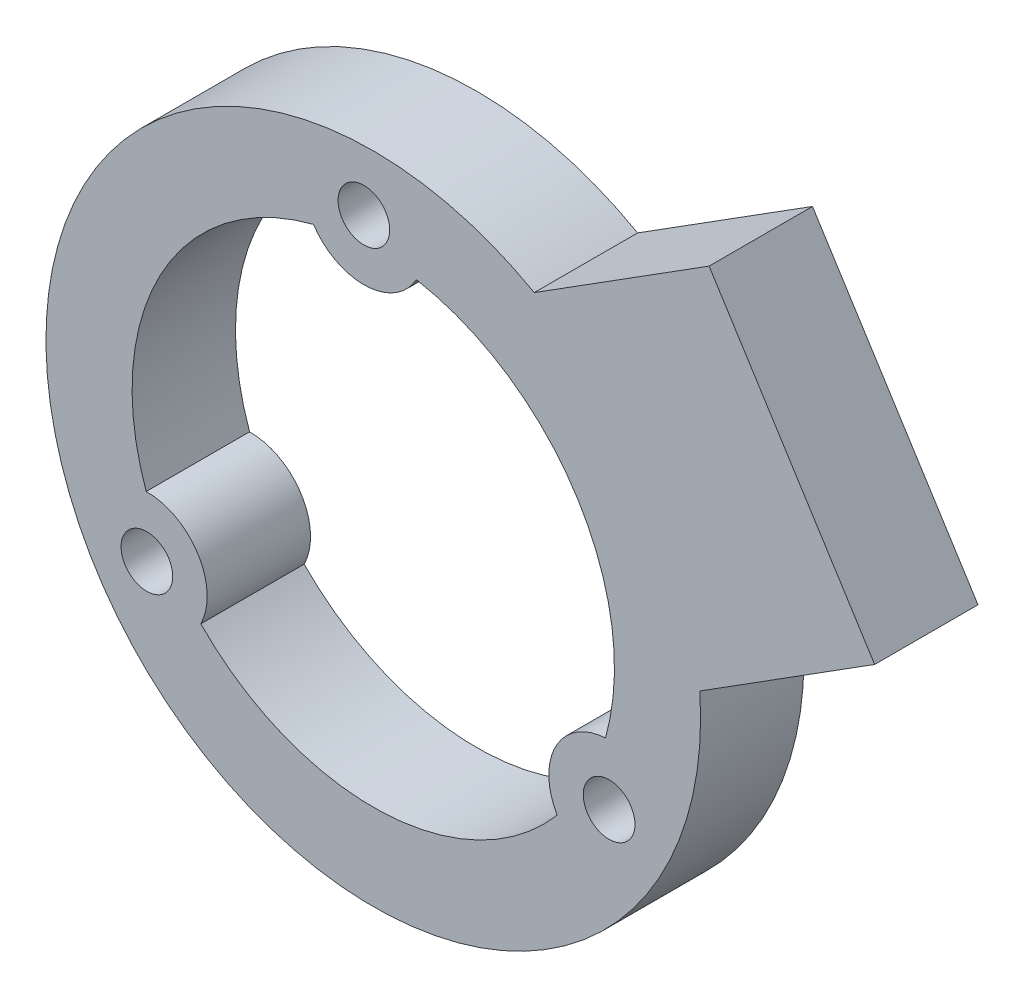
ISO-10303-21;
HEADER;
FILE_DESCRIPTION(('STEP AP214'),'2;1');
FILE_NAME('part.step','',(''),(''),'','','');
FILE_SCHEMA(('AUTOMOTIVE_DESIGN { 1 0 10303 214 1 1 1 1 }'));
ENDSEC;
DATA;
#1=APPLICATION_CONTEXT('core data for automotive mechanical design processes');
#2=APPLICATION_PROTOCOL_DEFINITION('international standard','automotive_design',2000,#1);
#3=PRODUCT_CONTEXT('',#1,'mechanical');
#4=PRODUCT('Part','Part','',(#3));
#5=PRODUCT_RELATED_PRODUCT_CATEGORY('part','',(#4));
#6=PRODUCT_DEFINITION_FORMATION('','',#4);
#7=PRODUCT_DEFINITION_CONTEXT('part definition',#1,'design');
#8=PRODUCT_DEFINITION('design','',#6,#7);
#9=PRODUCT_DEFINITION_SHAPE('','',#8);
#10=(LENGTH_UNIT() NAMED_UNIT(*) SI_UNIT(.MILLI.,.METRE.));
#11=(NAMED_UNIT(*) PLANE_ANGLE_UNIT() SI_UNIT($,.RADIAN.));
#12=(NAMED_UNIT(*) SI_UNIT($,.STERADIAN.) SOLID_ANGLE_UNIT());
#13=UNCERTAINTY_MEASURE_WITH_UNIT(LENGTH_MEASURE(1.E-05),#10,'distance_accuracy_value','');
#14=(GEOMETRIC_REPRESENTATION_CONTEXT(3) GLOBAL_UNCERTAINTY_ASSIGNED_CONTEXT((#13)) GLOBAL_UNIT_ASSIGNED_CONTEXT((#10,
#11,#12)) REPRESENTATION_CONTEXT('',''));
#15=CARTESIAN_POINT('',(0.,0.,0.));
#16=DIRECTION('',(0.,0.,1.));
#17=DIRECTION('',(1.,0.,0.));
#18=AXIS2_PLACEMENT_3D('',#15,#16,#17);
#19=CARTESIAN_POINT('',(0.,0.,6.));
#20=DIRECTION('',(0.,0.,1.));
#21=DIRECTION('',(1.,0.,0.));
#22=AXIS2_PLACEMENT_3D('',#19,#20,#21);
#23=PLANE('',#22);
#24=CARTESIAN_POINT('',(-13.1416847795504,-8.21864472738256,6.));
#25=DIRECTION('',(0.,0.,1.));
#26=DIRECTION('',(1.,0.,0.));
#27=AXIS2_PLACEMENT_3D('',#24,#25,#26);
#28=CIRCLE('',#27,1.5);
#29=CARTESIAN_POINT('',(-11.6416847795504,-8.21864472738256,6.));
#30=VERTEX_POINT('',#29);
#31=EDGE_CURVE('E274',#30,#30,#28,.T.);
#32=ORIENTED_EDGE('',*,*,#31,.F.);
#33=EDGE_LOOP('',(#32));
#34=FACE_BOUND('',#33,.T.);
#35=CARTESIAN_POINT('',(13.6883975083675,-7.2717105039268,6.));
#36=DIRECTION('',(0.,0.,-1.));
#37=DIRECTION('',(1.,0.,0.));
#38=AXIS2_PLACEMENT_3D('',#35,#36,#37);
#39=CIRCLE('',#38,3.5);
#40=CARTESIAN_POINT('',(10.6770331705431,-9.0554382928228,6.));
#41=VERTEX_POINT('',#40);
#42=CARTESIAN_POINT('',(13.4806381865757,-3.77788222191169,6.));
#43=VERTEX_POINT('',#42);
#44=EDGE_CURVE('E117',#41,#43,#39,.T.);
#45=ORIENTED_EDGE('',*,*,#44,.F.);
#46=CARTESIAN_POINT('',(0.,0.,6.));
#47=DIRECTION('',(0.,0.,1.));
#48=DIRECTION('',(1.,0.,0.));
#49=AXIS2_PLACEMENT_3D('',#46,#47,#48);
#50=CIRCLE('',#49,14.);
#51=CARTESIAN_POINT('',(-10.0120610699689,-9.78563401784541,6.));
#52=VERTEX_POINT('',#51);
#53=EDGE_CURVE('E109',#52,#41,#50,.T.);
#54=ORIENTED_EDGE('',*,*,#53,.F.);
#55=CARTESIAN_POINT('',(-13.1416847795504,-8.21864472738256,6.));
#56=DIRECTION('',(0.,0.,-1.));
#57=DIRECTION('',(1.,0.,0.));
#58=AXIS2_PLACEMENT_3D('',#55,#56,#57);
#59=CIRCLE('',#58,3.5);
#60=CARTESIAN_POINT('',(-13.1807561892585,-4.71886281632819,6.));
#61=VERTEX_POINT('',#60);
#62=EDGE_CURVE('E140',#61,#52,#59,.T.);
#63=ORIENTED_EDGE('',*,*,#62,.F.);
#64=CARTESIAN_POINT('',(0.,0.,6.));
#65=DIRECTION('',(0.,0.,1.));
#66=DIRECTION('',(1.,0.,0.));
#67=AXIS2_PLACEMENT_3D('',#64,#65,#66);
#68=CIRCLE('',#67,14.);
#69=CARTESIAN_POINT('',(-3.46857711660661,13.563516239757,6.));
#70=VERTEX_POINT('',#69);
#71=EDGE_CURVE('E138',#70,#61,#68,.T.);
#72=ORIENTED_EDGE('',*,*,#71,.F.);
#73=CARTESIAN_POINT('',(-0.546712728816841,15.4903552313092,6.));
#74=DIRECTION('',(0.,0.,-1.));
#75=DIRECTION('',(1.,0.,0.));
#76=AXIS2_PLACEMENT_3D('',#73,#74,#75);
#77=CIRCLE('',#76,3.5);
#78=CARTESIAN_POINT('',(2.5037230187155,13.7743011091508,6.));
#79=VERTEX_POINT('',#78);
#80=EDGE_CURVE('E133',#79,#70,#77,.T.);
#81=ORIENTED_EDGE('',*,*,#80,.F.);
#82=CARTESIAN_POINT('',(0.,0.,6.));
#83=DIRECTION('',(0.,0.,1.));
#84=DIRECTION('',(1.,0.,0.));
#85=AXIS2_PLACEMENT_3D('',#82,#83,#84);
#86=CIRCLE('',#85,14.);
#87=EDGE_CURVE('E131',#43,#79,#86,.T.);
#88=ORIENTED_EDGE('',*,*,#87,.F.);
#89=EDGE_LOOP('',(#45,#54,#63,#72,#81,#88));
#90=FACE_BOUND('',#89,.T.);
#91=DIRECTION('',(0.845574343467549,0.533857686719432,0.));
#92=VECTOR('',#91,1.);
#93=CARTESIAN_POINT('',(29.1009265892722,7.72711675535672,6.));
#94=LINE('',#93,#92);
#95=CARTESIAN_POINT('',(18.9540344676616,1.32082451472354,6.));
#96=VERTEX_POINT('',#95);
#97=CARTESIAN_POINT('',(29.1009265892722,7.72711675535672,6.));
#98=VERTEX_POINT('',#97);
#99=EDGE_CURVE('E163',#96,#98,#94,.T.);
#100=ORIENTED_EDGE('',*,*,#99,.T.);
#101=DIRECTION('',(-0.533801721376277,0.845609674882994,0.));
#102=VECTOR('',#101,1.);
#103=CARTESIAN_POINT('',(29.1009265892722,7.72711675535672,6.));
#104=LINE('',#103,#102);
#105=CARTESIAN_POINT('',(19.4924956044992,22.9480909032506,6.));
#106=VERTEX_POINT('',#105);
#107=EDGE_CURVE('E166',#98,#106,#104,.T.);
#108=ORIENTED_EDGE('',*,*,#107,.T.);
#109=DIRECTION('',(-0.845645004348162,-0.533745750916105,0.));
#110=VECTOR('',#109,1.);
#111=CARTESIAN_POINT('',(19.4924956044992,22.9480909032506,6.));
#112=LINE('',#111,#110);
#113=CARTESIAN_POINT('',(9.34475555232128,16.5431418922574,6.));
#114=VERTEX_POINT('',#113);
#115=EDGE_CURVE('E169',#106,#114,#112,.T.);
#116=ORIENTED_EDGE('',*,*,#115,.T.);
#117=CARTESIAN_POINT('',(0.,0.,6.));
#118=DIRECTION('',(0.,0.,1.));
#119=DIRECTION('',(1.,0.,0.));
#120=AXIS2_PLACEMENT_3D('',#117,#118,#119);
#121=CIRCLE('',#120,19.);
#122=EDGE_CURVE('E171',#114,#96,#121,.T.);
#123=ORIENTED_EDGE('',*,*,#122,.T.);
#124=EDGE_LOOP('',(#100,#108,#116,#123));
#125=FACE_BOUND('',#124,.T.);
#126=CARTESIAN_POINT('',(-0.546712728816841,15.4903552313092,6.));
#127=DIRECTION('',(0.,0.,1.));
#128=DIRECTION('',(1.,0.,0.));
#129=AXIS2_PLACEMENT_3D('',#126,#127,#128);
#130=CIRCLE('',#129,1.5);
#131=CARTESIAN_POINT('',(0.953287271183161,15.4903552313092,6.));
#132=VERTEX_POINT('',#131);
#133=EDGE_CURVE('E143',#132,#132,#130,.T.);
#134=ORIENTED_EDGE('',*,*,#133,.F.);
#135=EDGE_LOOP('',(#134));
#136=FACE_BOUND('',#135,.T.);
#137=CARTESIAN_POINT('',(13.6883975083675,-7.2717105039268,6.));
#138=DIRECTION('',(0.,0.,1.));
#139=DIRECTION('',(1.,0.,0.));
#140=AXIS2_PLACEMENT_3D('',#137,#138,#139);
#141=CIRCLE('',#140,1.5);
#142=CARTESIAN_POINT('',(15.1883975083675,-7.2717105039268,6.));
#143=VERTEX_POINT('',#142);
#144=EDGE_CURVE('E265',#143,#143,#141,.T.);
#145=ORIENTED_EDGE('',*,*,#144,.F.);
#146=EDGE_LOOP('',(#145));
#147=FACE_BOUND('',#146,.T.);
#148=ADVANCED_FACE('F32',(#34,#90,#125,#136,#147),#23,.T.);
#149=CARTESIAN_POINT('',(0.,0.,0.));
#150=DIRECTION('',(0.,0.,1.));
#151=DIRECTION('',(1.,0.,0.));
#152=AXIS2_PLACEMENT_3D('',#149,#150,#151);
#153=PLANE('',#152);
#154=DIRECTION('',(0.845574343467549,0.533857686719432,0.));
#155=VECTOR('',#154,1.);
#156=CARTESIAN_POINT('',(29.1009265892722,7.72711675535672,0.));
#157=LINE('',#156,#155);
#158=CARTESIAN_POINT('',(18.9540344676616,1.32082451472354,0.));
#159=VERTEX_POINT('',#158);
#160=CARTESIAN_POINT('',(29.1009265892722,7.72711675535672,0.));
#161=VERTEX_POINT('',#160);
#162=EDGE_CURVE('E125',#159,#161,#157,.T.);
#163=ORIENTED_EDGE('',*,*,#162,.F.);
#164=CARTESIAN_POINT('',(0.,0.,0.));
#165=DIRECTION('',(0.,0.,1.));
#166=DIRECTION('',(1.,0.,0.));
#167=AXIS2_PLACEMENT_3D('',#164,#165,#166);
#168=CIRCLE('',#167,19.);
#169=CARTESIAN_POINT('',(9.34475555232128,16.5431418922574,0.));
#170=VERTEX_POINT('',#169);
#171=EDGE_CURVE('E167',#170,#159,#168,.T.);
#172=ORIENTED_EDGE('',*,*,#171,.F.);
#173=DIRECTION('',(-0.845645004348162,-0.533745750916105,0.));
#174=VECTOR('',#173,1.);
#175=CARTESIAN_POINT('',(19.4924956044992,22.9480909032506,0.));
#176=LINE('',#175,#174);
#177=CARTESIAN_POINT('',(19.4924956044992,22.9480909032506,0.));
#178=VERTEX_POINT('',#177);
#179=EDGE_CURVE('E178',#178,#170,#176,.T.);
#180=ORIENTED_EDGE('',*,*,#179,.F.);
#181=DIRECTION('',(-0.533801721376277,0.845609674882994,0.));
#182=VECTOR('',#181,1.);
#183=CARTESIAN_POINT('',(29.1009265892722,7.72711675535672,0.));
#184=LINE('',#183,#182);
#185=EDGE_CURVE('E176',#161,#178,#184,.T.);
#186=ORIENTED_EDGE('',*,*,#185,.F.);
#187=EDGE_LOOP('',(#163,#172,#180,#186));
#188=FACE_BOUND('',#187,.T.);
#189=CARTESIAN_POINT('',(0.,0.,0.));
#190=DIRECTION('',(0.,0.,1.));
#191=DIRECTION('',(1.,0.,0.));
#192=AXIS2_PLACEMENT_3D('',#189,#190,#191);
#193=CIRCLE('',#192,14.);
#194=CARTESIAN_POINT('',(-10.0120610699689,-9.78563401784541,0.));
#195=VERTEX_POINT('',#194);
#196=CARTESIAN_POINT('',(10.6770331705431,-9.0554382928228,0.));
#197=VERTEX_POINT('',#196);
#198=EDGE_CURVE('E55',#195,#197,#193,.T.);
#199=ORIENTED_EDGE('',*,*,#198,.T.);
#200=CARTESIAN_POINT('',(13.6883975083675,-7.2717105039268,0.));
#201=DIRECTION('',(0.,0.,-1.));
#202=DIRECTION('',(1.,0.,0.));
#203=AXIS2_PLACEMENT_3D('',#200,#201,#202);
#204=CIRCLE('',#203,3.5);
#205=CARTESIAN_POINT('',(13.4806381865757,-3.77788222191169,0.));
#206=VERTEX_POINT('',#205);
#207=EDGE_CURVE('E124',#197,#206,#204,.T.);
#208=ORIENTED_EDGE('',*,*,#207,.T.);
#209=CARTESIAN_POINT('',(0.,0.,0.));
#210=DIRECTION('',(0.,0.,1.));
#211=DIRECTION('',(1.,0.,0.));
#212=AXIS2_PLACEMENT_3D('',#209,#210,#211);
#213=CIRCLE('',#212,14.);
#214=CARTESIAN_POINT('',(2.5037230187155,13.7743011091508,0.));
#215=VERTEX_POINT('',#214);
#216=EDGE_CURVE('E145',#206,#215,#213,.T.);
#217=ORIENTED_EDGE('',*,*,#216,.T.);
#218=CARTESIAN_POINT('',(-0.546712728816841,15.4903552313092,0.));
#219=DIRECTION('',(0.,0.,-1.));
#220=DIRECTION('',(1.,0.,0.));
#221=AXIS2_PLACEMENT_3D('',#218,#219,#220);
#222=CIRCLE('',#221,3.5);
#223=CARTESIAN_POINT('',(-3.46857711660661,13.563516239757,0.));
#224=VERTEX_POINT('',#223);
#225=EDGE_CURVE('E148',#215,#224,#222,.T.);
#226=ORIENTED_EDGE('',*,*,#225,.T.);
#227=CARTESIAN_POINT('',(0.,0.,0.));
#228=DIRECTION('',(0.,0.,1.));
#229=DIRECTION('',(1.,0.,0.));
#230=AXIS2_PLACEMENT_3D('',#227,#228,#229);
#231=CIRCLE('',#230,14.);
#232=CARTESIAN_POINT('',(-13.1807561892585,-4.71886281632818,0.));
#233=VERTEX_POINT('',#232);
#234=EDGE_CURVE('E151',#224,#233,#231,.T.);
#235=ORIENTED_EDGE('',*,*,#234,.T.);
#236=CARTESIAN_POINT('',(-13.1416847795504,-8.21864472738256,0.));
#237=DIRECTION('',(0.,0.,-1.));
#238=DIRECTION('',(1.,0.,0.));
#239=AXIS2_PLACEMENT_3D('',#236,#237,#238);
#240=CIRCLE('',#239,3.5);
#241=EDGE_CURVE('E118',#233,#195,#240,.T.);
#242=ORIENTED_EDGE('',*,*,#241,.T.);
#243=EDGE_LOOP('',(#199,#208,#217,#226,#235,#242));
#244=FACE_BOUND('',#243,.T.);
#245=CARTESIAN_POINT('',(-0.546712728816841,15.4903552313092,0.));
#246=DIRECTION('',(0.,0.,1.));
#247=DIRECTION('',(1.,0.,0.));
#248=AXIS2_PLACEMENT_3D('',#245,#246,#247);
#249=CIRCLE('',#248,1.5);
#250=CARTESIAN_POINT('',(0.953287271183161,15.4903552313092,0.));
#251=VERTEX_POINT('',#250);
#252=EDGE_CURVE('E277',#251,#251,#249,.T.);
#253=ORIENTED_EDGE('',*,*,#252,.T.);
#254=EDGE_LOOP('',(#253));
#255=FACE_BOUND('',#254,.T.);
#256=CARTESIAN_POINT('',(-13.1416847795504,-8.21864472738256,0.));
#257=DIRECTION('',(0.,0.,1.));
#258=DIRECTION('',(1.,0.,0.));
#259=AXIS2_PLACEMENT_3D('',#256,#257,#258);
#260=CIRCLE('',#259,1.5);
#261=CARTESIAN_POINT('',(-11.6416847795504,-8.21864472738256,0.));
#262=VERTEX_POINT('',#261);
#263=EDGE_CURVE('E271',#262,#262,#260,.T.);
#264=ORIENTED_EDGE('',*,*,#263,.T.);
#265=EDGE_LOOP('',(#264));
#266=FACE_BOUND('',#265,.T.);
#267=CARTESIAN_POINT('',(13.6883975083675,-7.2717105039268,0.));
#268=DIRECTION('',(0.,0.,1.));
#269=DIRECTION('',(1.,0.,0.));
#270=AXIS2_PLACEMENT_3D('',#267,#268,#269);
#271=CIRCLE('',#270,1.5);
#272=CARTESIAN_POINT('',(15.1883975083675,-7.2717105039268,0.));
#273=VERTEX_POINT('',#272);
#274=EDGE_CURVE('E268',#273,#273,#271,.T.);
#275=ORIENTED_EDGE('',*,*,#274,.T.);
#276=EDGE_LOOP('',(#275));
#277=FACE_BOUND('',#276,.T.);
#278=ADVANCED_FACE('F196',(#188,#244,#255,#266,#277),#153,.F.);
#279=CARTESIAN_POINT('',(29.1009265892722,7.72711675535672,6.));
#280=DIRECTION('',(-0.533857686719433,0.845574343467549,0.));
#281=DIRECTION('',(-0.845574343467549,-0.533857686719433,0.));
#282=AXIS2_PLACEMENT_3D('',#279,#280,#281);
#283=PLANE('',#282);
#284=ORIENTED_EDGE('',*,*,#162,.T.);
#285=DIRECTION('',(0.,0.,-1.));
#286=VECTOR('',#285,1.);
#287=CARTESIAN_POINT('',(29.1009265892722,7.72711675535672,6.));
#288=LINE('',#287,#286);
#289=EDGE_CURVE('E11',#98,#161,#288,.T.);
#290=ORIENTED_EDGE('',*,*,#289,.F.);
#291=ORIENTED_EDGE('',*,*,#99,.F.);
#292=DIRECTION('',(0.,0.,-1.));
#293=VECTOR('',#292,1.);
#294=CARTESIAN_POINT('',(18.9540344676616,1.32082451472354,6.));
#295=LINE('',#294,#293);
#296=EDGE_CURVE('E173',#96,#159,#295,.T.);
#297=ORIENTED_EDGE('',*,*,#296,.T.);
#298=EDGE_LOOP('',(#284,#290,#291,#297));
#299=FACE_BOUND('',#298,.T.);
#300=ADVANCED_FACE('F34',(#299),#283,.F.);
#301=CARTESIAN_POINT('',(29.1009265892722,7.72711675535672,6.));
#302=DIRECTION('',(-0.845609674882994,-0.533801721376277,0.));
#303=DIRECTION('',(0.533801721376277,-0.845609674882994,0.));
#304=AXIS2_PLACEMENT_3D('',#301,#302,#303);
#305=PLANE('',#304);
#306=ORIENTED_EDGE('',*,*,#185,.T.);
#307=DIRECTION('',(0.,0.,-1.));
#308=VECTOR('',#307,1.);
#309=CARTESIAN_POINT('',(19.4924956044992,22.9480909032506,6.));
#310=LINE('',#309,#308);
#311=EDGE_CURVE('E40',#106,#178,#310,.T.);
#312=ORIENTED_EDGE('',*,*,#311,.F.);
#313=ORIENTED_EDGE('',*,*,#107,.F.);
#314=ORIENTED_EDGE('',*,*,#289,.T.);
#315=EDGE_LOOP('',(#306,#312,#313,#314));
#316=FACE_BOUND('',#315,.T.);
#317=ADVANCED_FACE('F206',(#316),#305,.F.);
#318=CARTESIAN_POINT('',(19.4924956044992,22.9480909032506,6.));
#319=DIRECTION('',(0.533745750916105,-0.845645004348162,0.));
#320=DIRECTION('',(0.845645004348162,0.533745750916105,0.));
#321=AXIS2_PLACEMENT_3D('',#318,#319,#320);
#322=PLANE('',#321);
#323=ORIENTED_EDGE('',*,*,#179,.T.);
#324=DIRECTION('',(0.,0.,-1.));
#325=VECTOR('',#324,1.);
#326=CARTESIAN_POINT('',(9.34475555232128,16.5431418922574,6.));
#327=LINE('',#326,#325);
#328=EDGE_CURVE('E183',#114,#170,#327,.T.);
#329=ORIENTED_EDGE('',*,*,#328,.F.);
#330=ORIENTED_EDGE('',*,*,#115,.F.);
#331=ORIENTED_EDGE('',*,*,#311,.T.);
#332=EDGE_LOOP('',(#323,#329,#330,#331));
#333=FACE_BOUND('',#332,.T.);
#334=ADVANCED_FACE('F190',(#333),#322,.F.);
#335=CARTESIAN_POINT('',(0.,0.,6.));
#336=DIRECTION('',(0.,0.,-1.));
#337=DIRECTION('',(-1.,0.,0.));
#338=AXIS2_PLACEMENT_3D('',#335,#336,#337);
#339=CYLINDRICAL_SURFACE('',#338,19.);
#340=ORIENTED_EDGE('',*,*,#171,.T.);
#341=ORIENTED_EDGE('',*,*,#296,.F.);
#342=ORIENTED_EDGE('',*,*,#122,.F.);
#343=ORIENTED_EDGE('',*,*,#328,.T.);
#344=EDGE_LOOP('',(#340,#341,#342,#343));
#345=FACE_BOUND('',#344,.T.);
#346=ADVANCED_FACE('F200',(#345),#339,.T.);
#347=CARTESIAN_POINT('',(0.,0.,6.));
#348=DIRECTION('',(0.,0.,-1.));
#349=DIRECTION('',(-1.,0.,0.));
#350=AXIS2_PLACEMENT_3D('',#347,#348,#349);
#351=CYLINDRICAL_SURFACE('',#350,14.);
#352=ORIENTED_EDGE('',*,*,#198,.F.);
#353=DIRECTION('',(0.,0.,-1.));
#354=VECTOR('',#353,1.);
#355=CARTESIAN_POINT('',(-10.0120610699689,-9.78563401784541,6.));
#356=LINE('',#355,#354);
#357=EDGE_CURVE('E113',#52,#195,#356,.T.);
#358=ORIENTED_EDGE('',*,*,#357,.F.);
#359=ORIENTED_EDGE('',*,*,#53,.T.);
#360=DIRECTION('',(0.,0.,-1.));
#361=VECTOR('',#360,1.);
#362=CARTESIAN_POINT('',(10.6770331705431,-9.0554382928228,6.));
#363=LINE('',#362,#361);
#364=EDGE_CURVE('E112',#41,#197,#363,.T.);
#365=ORIENTED_EDGE('',*,*,#364,.T.);
#366=EDGE_LOOP('',(#352,#358,#359,#365));
#367=FACE_BOUND('',#366,.T.);
#368=ADVANCED_FACE('F111',(#367),#351,.F.);
#369=CARTESIAN_POINT('',(13.6883975083675,-7.2717105039268,6.));
#370=DIRECTION('',(0.,0.,-1.));
#371=DIRECTION('',(-1.,0.,0.));
#372=AXIS2_PLACEMENT_3D('',#369,#370,#371);
#373=CYLINDRICAL_SURFACE('',#372,3.5);
#374=ORIENTED_EDGE('',*,*,#207,.F.);
#375=ORIENTED_EDGE('',*,*,#364,.F.);
#376=ORIENTED_EDGE('',*,*,#44,.T.);
#377=DIRECTION('',(0.,0.,-1.));
#378=VECTOR('',#377,1.);
#379=CARTESIAN_POINT('',(13.4806381865757,-3.77788222191169,6.));
#380=LINE('',#379,#378);
#381=EDGE_CURVE('E126',#43,#206,#380,.T.);
#382=ORIENTED_EDGE('',*,*,#381,.T.);
#383=EDGE_LOOP('',(#374,#375,#376,#382));
#384=FACE_BOUND('',#383,.T.);
#385=ADVANCED_FACE('F121',(#384),#373,.T.);
#386=CARTESIAN_POINT('',(0.,0.,6.));
#387=DIRECTION('',(0.,0.,-1.));
#388=DIRECTION('',(-1.,0.,0.));
#389=AXIS2_PLACEMENT_3D('',#386,#387,#388);
#390=CYLINDRICAL_SURFACE('',#389,14.);
#391=ORIENTED_EDGE('',*,*,#216,.F.);
#392=ORIENTED_EDGE('',*,*,#381,.F.);
#393=ORIENTED_EDGE('',*,*,#87,.T.);
#394=DIRECTION('',(0.,0.,-1.));
#395=VECTOR('',#394,1.);
#396=CARTESIAN_POINT('',(2.5037230187155,13.7743011091508,6.));
#397=LINE('',#396,#395);
#398=EDGE_CURVE('E160',#79,#215,#397,.T.);
#399=ORIENTED_EDGE('',*,*,#398,.T.);
#400=EDGE_LOOP('',(#391,#392,#393,#399));
#401=FACE_BOUND('',#400,.T.);
#402=ADVANCED_FACE('F231',(#401),#390,.F.);
#403=CARTESIAN_POINT('',(-0.546712728816841,15.4903552313092,6.));
#404=DIRECTION('',(0.,0.,-1.));
#405=DIRECTION('',(-1.,0.,0.));
#406=AXIS2_PLACEMENT_3D('',#403,#404,#405);
#407=CYLINDRICAL_SURFACE('',#406,3.5);
#408=ORIENTED_EDGE('',*,*,#225,.F.);
#409=ORIENTED_EDGE('',*,*,#398,.F.);
#410=ORIENTED_EDGE('',*,*,#80,.T.);
#411=DIRECTION('',(0.,0.,-1.));
#412=VECTOR('',#411,1.);
#413=CARTESIAN_POINT('',(-3.46857711660661,13.563516239757,6.));
#414=LINE('',#413,#412);
#415=EDGE_CURVE('E158',#70,#224,#414,.T.);
#416=ORIENTED_EDGE('',*,*,#415,.T.);
#417=EDGE_LOOP('',(#408,#409,#410,#416));
#418=FACE_BOUND('',#417,.T.);
#419=ADVANCED_FACE('F235',(#418),#407,.T.);
#420=CARTESIAN_POINT('',(0.,0.,6.));
#421=DIRECTION('',(0.,0.,-1.));
#422=DIRECTION('',(-1.,0.,0.));
#423=AXIS2_PLACEMENT_3D('',#420,#421,#422);
#424=CYLINDRICAL_SURFACE('',#423,14.);
#425=ORIENTED_EDGE('',*,*,#234,.F.);
#426=ORIENTED_EDGE('',*,*,#415,.F.);
#427=ORIENTED_EDGE('',*,*,#71,.T.);
#428=DIRECTION('',(0.,0.,-1.));
#429=VECTOR('',#428,1.);
#430=CARTESIAN_POINT('',(-13.1807561892585,-4.71886281632818,6.));
#431=LINE('',#430,#429);
#432=EDGE_CURVE('E47',#61,#233,#431,.T.);
#433=ORIENTED_EDGE('',*,*,#432,.T.);
#434=EDGE_LOOP('',(#425,#426,#427,#433));
#435=FACE_BOUND('',#434,.T.);
#436=ADVANCED_FACE('F241',(#435),#424,.F.);
#437=CARTESIAN_POINT('',(-13.1416847795504,-8.21864472738256,6.));
#438=DIRECTION('',(0.,0.,-1.));
#439=DIRECTION('',(-1.,0.,0.));
#440=AXIS2_PLACEMENT_3D('',#437,#438,#439);
#441=CYLINDRICAL_SURFACE('',#440,3.5);
#442=ORIENTED_EDGE('',*,*,#241,.F.);
#443=ORIENTED_EDGE('',*,*,#432,.F.);
#444=ORIENTED_EDGE('',*,*,#62,.T.);
#445=ORIENTED_EDGE('',*,*,#357,.T.);
#446=EDGE_LOOP('',(#442,#443,#444,#445));
#447=FACE_BOUND('',#446,.T.);
#448=ADVANCED_FACE('F245',(#447),#441,.T.);
#449=CARTESIAN_POINT('',(-0.546712728816841,15.4903552313092,6.));
#450=DIRECTION('',(0.,0.,-1.));
#451=DIRECTION('',(-1.,0.,0.));
#452=AXIS2_PLACEMENT_3D('',#449,#450,#451);
#453=CYLINDRICAL_SURFACE('',#452,1.5);
#454=ORIENTED_EDGE('',*,*,#133,.T.);
#455=EDGE_LOOP('',(#454));
#456=FACE_BOUND('',#455,.T.);
#457=ORIENTED_EDGE('',*,*,#252,.F.);
#458=EDGE_LOOP('',(#457));
#459=FACE_BOUND('',#458,.T.);
#460=ADVANCED_FACE('F249',(#456,#459),#453,.F.);
#461=CARTESIAN_POINT('',(-13.1416847795504,-8.21864472738256,6.));
#462=DIRECTION('',(0.,0.,-1.));
#463=DIRECTION('',(-1.,0.,0.));
#464=AXIS2_PLACEMENT_3D('',#461,#462,#463);
#465=CYLINDRICAL_SURFACE('',#464,1.5);
#466=ORIENTED_EDGE('',*,*,#31,.T.);
#467=EDGE_LOOP('',(#466));
#468=FACE_BOUND('',#467,.T.);
#469=ORIENTED_EDGE('',*,*,#263,.F.);
#470=EDGE_LOOP('',(#469));
#471=FACE_BOUND('',#470,.T.);
#472=ADVANCED_FACE('F252',(#468,#471),#465,.F.);
#473=CARTESIAN_POINT('',(13.6883975083675,-7.2717105039268,6.));
#474=DIRECTION('',(0.,0.,-1.));
#475=DIRECTION('',(-1.,0.,0.));
#476=AXIS2_PLACEMENT_3D('',#473,#474,#475);
#477=CYLINDRICAL_SURFACE('',#476,1.5);
#478=ORIENTED_EDGE('',*,*,#144,.T.);
#479=EDGE_LOOP('',(#478));
#480=FACE_BOUND('',#479,.T.);
#481=ORIENTED_EDGE('',*,*,#274,.F.);
#482=EDGE_LOOP('',(#481));
#483=FACE_BOUND('',#482,.T.);
#484=ADVANCED_FACE('F256',(#480,#483),#477,.F.);
#485=CLOSED_SHELL('',(#148,#278,#300,#317,#334,#346,#368,#385,#402,#419,#436,#448,#460,#472,#484));
#486=MANIFOLD_SOLID_BREP('B2',#485);
#487=ADVANCED_BREP_SHAPE_REPRESENTATION('',(#18,#486),#14);
#488=SHAPE_DEFINITION_REPRESENTATION(#9,#487);
ENDSEC;
END-ISO-10303-21;
